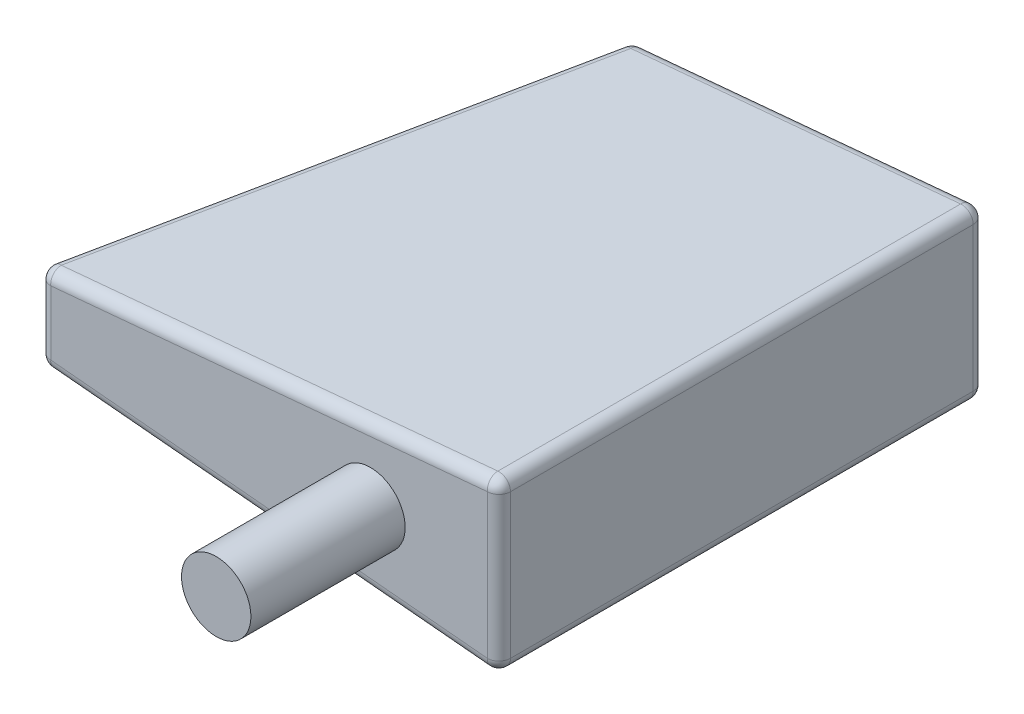
ISO-10303-21;
HEADER;
FILE_DESCRIPTION(('STEP AP214'),'2;1');
FILE_NAME('part.step','',(''),(''),'','','');
FILE_SCHEMA(('AUTOMOTIVE_DESIGN { 1 0 10303 214 1 1 1 1 }'));
ENDSEC;
DATA;
#1=APPLICATION_CONTEXT('core data for automotive mechanical design processes');
#2=APPLICATION_PROTOCOL_DEFINITION('international standard','automotive_design',2000,#1);
#3=PRODUCT_CONTEXT('',#1,'mechanical');
#4=PRODUCT('Part','Part','',(#3));
#5=PRODUCT_RELATED_PRODUCT_CATEGORY('part','',(#4));
#6=PRODUCT_DEFINITION_FORMATION('','',#4);
#7=PRODUCT_DEFINITION_CONTEXT('part definition',#1,'design');
#8=PRODUCT_DEFINITION('design','',#6,#7);
#9=PRODUCT_DEFINITION_SHAPE('','',#8);
#10=(LENGTH_UNIT() NAMED_UNIT(*) SI_UNIT(.MILLI.,.METRE.));
#11=(NAMED_UNIT(*) PLANE_ANGLE_UNIT() SI_UNIT($,.RADIAN.));
#12=(NAMED_UNIT(*) SI_UNIT($,.STERADIAN.) SOLID_ANGLE_UNIT());
#13=UNCERTAINTY_MEASURE_WITH_UNIT(LENGTH_MEASURE(1.E-05),#10,'distance_accuracy_value','');
#14=(GEOMETRIC_REPRESENTATION_CONTEXT(3) GLOBAL_UNCERTAINTY_ASSIGNED_CONTEXT((#13)) GLOBAL_UNIT_ASSIGNED_CONTEXT((#10,
#11,#12)) REPRESENTATION_CONTEXT('',''));
#15=CARTESIAN_POINT('',(0.,0.,0.));
#16=DIRECTION('',(0.,0.,1.));
#17=DIRECTION('',(1.,0.,0.));
#18=AXIS2_PLACEMENT_3D('',#15,#16,#17);
#19=CARTESIAN_POINT('',(-130.198606722362,2.75,167.44232142799));
#20=DIRECTION('',(-0.0912839495849539,0.995824904563132,0.));
#21=DIRECTION('',(-0.995824904563132,-0.0912839495849539,0.));
#22=AXIS2_PLACEMENT_3D('',#19,#20,#21);
#23=PLANE('',#22);
#24=DIRECTION('',(0.,0.,1.));
#25=VECTOR('',#24,1.);
#26=CARTESIAN_POINT('',(-101.017069684551,5.42497422846603,167.44232142799));
#27=LINE('',#26,#25);
#28=CARTESIAN_POINT('',(-101.017069684551,5.42497422846603,205.692321429153));
#29=VERTEX_POINT('',#28);
#30=CARTESIAN_POINT('',(-101.017069684551,5.42497422846603,175.69232142799));
#31=VERTEX_POINT('',#30);
#32=EDGE_CURVE('E198',#29,#31,#27,.F.);
#33=ORIENTED_EDGE('',*,*,#32,.T.);
#34=DIRECTION('',(0.995824904563132,0.0912839495849539,0.));
#35=VECTOR('',#34,1.);
#36=CARTESIAN_POINT('',(-122.224993582982,3.4809145377765,175.69232142799));
#37=LINE('',#36,#35);
#38=CARTESIAN_POINT('',(-122.398144726326,3.46504234963662,175.69232142799));
#39=VERTEX_POINT('',#38);
#40=EDGE_CURVE('E242',#31,#39,#37,.F.);
#41=ORIENTED_EDGE('',*,*,#40,.T.);
#42=DIRECTION('',(-0.224903244369558,-0.0206161307338762,0.974162977034957));
#43=VECTOR('',#42,1.);
#44=CARTESIAN_POINT('',(-120.988506529526,3.59425918434334,169.586507587079));
#45=LINE('',#44,#43);
#46=CARTESIAN_POINT('',(-129.324190460362,2.83015482401671,205.692321429153));
#47=VERTEX_POINT('',#46);
#48=EDGE_CURVE('E193',#39,#47,#45,.T.);
#49=ORIENTED_EDGE('',*,*,#48,.T.);
#50=DIRECTION('',(-0.995824904563132,-0.0912839495849539,0.));
#51=VECTOR('',#50,1.);
#52=CARTESIAN_POINT('',(-130.198606722362,2.75,205.692321429153));
#53=LINE('',#52,#51);
#54=EDGE_CURVE('E195',#47,#29,#53,.F.);
#55=ORIENTED_EDGE('',*,*,#54,.T.);
#56=EDGE_LOOP('',(#33,#41,#49,#55));
#57=FACE_BOUND('',#56,.T.);
#58=ADVANCED_FACE('F48',(#57),#23,.T.);
#59=CARTESIAN_POINT('',(-100.198606722362,-5.5,167.44232142799));
#60=DIRECTION('',(-0.0912839495849537,-0.995824904563132,0.));
#61=DIRECTION('',(0.995824904563132,-0.0912839495849537,0.));
#62=AXIS2_PLACEMENT_3D('',#59,#60,#61);
#63=PLANE('',#62);
#64=DIRECTION('',(0.224903244369558,-0.0206161307338762,-0.974162977034957));
#65=VECTOR('',#64,1.);
#66=CARTESIAN_POINT('',(-119.458311704294,-3.73452704332291,162.958505618634));
#67=LINE('',#66,#65);
#68=CARTESIAN_POINT('',(-129.324190460362,-2.83015482401672,205.692321429153));
#69=VERTEX_POINT('',#68);
#70=CARTESIAN_POINT('',(-122.398144726326,-3.46504234963662,175.69232142799));
#71=VERTEX_POINT('',#70);
#72=EDGE_CURVE('E201',#69,#71,#67,.T.);
#73=ORIENTED_EDGE('',*,*,#72,.T.);
#74=DIRECTION('',(-0.995824904563132,0.0912839495849537,0.));
#75=VECTOR('',#74,1.);
#76=CARTESIAN_POINT('',(-101.017069684551,-5.42497422846604,175.69232142799));
#77=LINE('',#76,#75);
#78=CARTESIAN_POINT('',(-101.017069684551,-5.42497422846604,175.69232142799));
#79=VERTEX_POINT('',#78);
#80=EDGE_CURVE('E72',#71,#79,#77,.F.);
#81=ORIENTED_EDGE('',*,*,#80,.T.);
#82=DIRECTION('',(0.,0.,1.));
#83=VECTOR('',#82,1.);
#84=CARTESIAN_POINT('',(-101.017069684551,-5.42497422846604,167.44232142799));
#85=LINE('',#84,#83);
#86=CARTESIAN_POINT('',(-101.017069684551,-5.42497422846604,205.692321429153));
#87=VERTEX_POINT('',#86);
#88=EDGE_CURVE('E206',#79,#87,#85,.T.);
#89=ORIENTED_EDGE('',*,*,#88,.T.);
#90=DIRECTION('',(0.995824904563132,-0.0912839495849537,0.));
#91=VECTOR('',#90,1.);
#92=CARTESIAN_POINT('',(-100.198606722362,-5.5,205.692321429153));
#93=LINE('',#92,#91);
#94=EDGE_CURVE('E203',#87,#69,#93,.F.);
#95=ORIENTED_EDGE('',*,*,#94,.T.);
#96=EDGE_LOOP('',(#73,#81,#89,#95));
#97=FACE_BOUND('',#96,.T.);
#98=ADVANCED_FACE('F284',(#97),#63,.T.);
#99=CARTESIAN_POINT('',(-100.198606721144,-4.4532716159149E-05,206.442321429153));
#100=DIRECTION('',(0.,0.,1.));
#101=DIRECTION('',(1.,0.,0.));
#102=AXIS2_PLACEMENT_3D('',#99,#100,#101);
#103=PLANE('',#102);
#104=DIRECTION('',(0.,1.,0.));
#105=VECTOR('',#104,1.);
#106=CARTESIAN_POINT('',(-100.948606722362,-4.4532716159149E-05,206.442321429153));
#107=LINE('',#106,#105);
#108=CARTESIAN_POINT('',(-100.948606722362,-4.67810555004369,206.442321429153));
#109=VERTEX_POINT('',#108);
#110=CARTESIAN_POINT('',(-100.948606722362,4.67810555004369,206.442321429153));
#111=VERTEX_POINT('',#110);
#112=EDGE_CURVE('E168',#109,#111,#107,.T.);
#113=ORIENTED_EDGE('',*,*,#112,.T.);
#114=DIRECTION('',(-0.995824904563132,-0.0912839495849539,0.));
#115=VECTOR('',#114,1.);
#116=CARTESIAN_POINT('',(-100.630113374225,4.70730077362293,206.442321429153));
#117=LINE('',#116,#115);
#118=CARTESIAN_POINT('',(-129.255727498173,2.08328614559436,206.442321429153));
#119=VERTEX_POINT('',#118);
#120=EDGE_CURVE('E174',#111,#119,#117,.T.);
#121=ORIENTED_EDGE('',*,*,#120,.T.);
#122=DIRECTION('',(0.,-1.,0.));
#123=VECTOR('',#122,1.);
#124=CARTESIAN_POINT('',(-129.255727498173,-4.4532716159149E-05,206.442321429153));
#125=LINE('',#124,#123);
#126=CARTESIAN_POINT('',(-129.255727498173,-2.08328614559437,206.442321429153));
#127=VERTEX_POINT('',#126);
#128=EDGE_CURVE('E144',#119,#127,#125,.T.);
#129=ORIENTED_EDGE('',*,*,#128,.T.);
#130=DIRECTION('',(0.995824904563132,-0.0912839495849537,0.));
#131=VECTOR('',#130,1.);
#132=CARTESIAN_POINT('',(-100.630105277925,-4.70730151578375,206.442321429153));
#133=LINE('',#132,#131);
#134=EDGE_CURVE('E162',#127,#109,#133,.T.);
#135=ORIENTED_EDGE('',*,*,#134,.T.);
#136=EDGE_LOOP('',(#113,#121,#129,#135));
#137=FACE_BOUND('',#136,.T.);
#138=CARTESIAN_POINT('',(-108.529819655251,0.,206.442321429153));
#139=DIRECTION('',(0.,0.,1.));
#140=DIRECTION('',(1.,0.,0.));
#141=AXIS2_PLACEMENT_3D('',#138,#139,#140);
#142=CIRCLE('',#141,2.25);
#143=CARTESIAN_POINT('',(-106.279819655251,0.,206.442321429153));
#144=VERTEX_POINT('',#143);
#145=EDGE_CURVE('E230',#144,#144,#142,.T.);
#146=ORIENTED_EDGE('',*,*,#145,.F.);
#147=EDGE_LOOP('',(#146));
#148=FACE_BOUND('',#147,.T.);
#149=ADVANCED_FACE('F171',(#137,#148),#103,.T.);
#150=CARTESIAN_POINT('',(-108.529819655251,0.,216.442321429153));
#151=DIRECTION('',(0.,0.,-1.));
#152=DIRECTION('',(-1.,0.,0.));
#153=AXIS2_PLACEMENT_3D('',#150,#151,#152);
#154=CYLINDRICAL_SURFACE('',#153,2.25);
#155=CARTESIAN_POINT('',(-108.529819655251,0.,216.442321429153));
#156=DIRECTION('',(0.,0.,1.));
#157=DIRECTION('',(1.,0.,0.));
#158=AXIS2_PLACEMENT_3D('',#155,#156,#157);
#159=CIRCLE('',#158,2.25);
#160=CARTESIAN_POINT('',(-106.279819655251,0.,216.442321429153));
#161=VERTEX_POINT('',#160);
#162=EDGE_CURVE('E169',#161,#161,#159,.T.);
#163=ORIENTED_EDGE('',*,*,#162,.F.);
#164=EDGE_LOOP('',(#163));
#165=FACE_BOUND('',#164,.T.);
#166=ORIENTED_EDGE('',*,*,#145,.T.);
#167=EDGE_LOOP('',(#166));
#168=FACE_BOUND('',#167,.T.);
#169=ADVANCED_FACE('F339',(#165,#168),#154,.T.);
#170=CARTESIAN_POINT('',(-108.529819655251,0.,216.442321429153));
#171=DIRECTION('',(0.,0.,1.));
#172=DIRECTION('',(1.,0.,0.));
#173=AXIS2_PLACEMENT_3D('',#170,#171,#172);
#174=PLANE('',#173);
#175=ORIENTED_EDGE('',*,*,#162,.T.);
#176=EDGE_LOOP('',(#175));
#177=FACE_BOUND('',#176,.T.);
#178=ADVANCED_FACE('F324',(#177),#174,.T.);
#179=CARTESIAN_POINT('',(-100.198606722362,5.5,167.44232142799));
#180=DIRECTION('',(1.,0.,0.));
#181=DIRECTION('',(0.,0.,-1.));
#182=AXIS2_PLACEMENT_3D('',#179,#180,#181);
#183=PLANE('',#182);
#184=DIRECTION('',(0.,0.,1.));
#185=VECTOR('',#184,1.);
#186=CARTESIAN_POINT('',(-100.198606722362,-4.67810555004369,167.44232142799));
#187=LINE('',#186,#185);
#188=CARTESIAN_POINT('',(-100.198606722362,-4.67810555004369,205.692321429153));
#189=VERTEX_POINT('',#188);
#190=CARTESIAN_POINT('',(-100.198606722362,-4.67810555004369,175.69232142799));
#191=VERTEX_POINT('',#190);
#192=EDGE_CURVE('E186',#189,#191,#187,.F.);
#193=ORIENTED_EDGE('',*,*,#192,.T.);
#194=DIRECTION('',(0.,-1.,0.));
#195=VECTOR('',#194,1.);
#196=CARTESIAN_POINT('',(-100.198606722362,4.67810555004368,175.69232142799));
#197=LINE('',#196,#195);
#198=CARTESIAN_POINT('',(-100.198606722362,4.67810555004368,175.69232142799));
#199=VERTEX_POINT('',#198);
#200=EDGE_CURVE('E12',#191,#199,#197,.F.);
#201=ORIENTED_EDGE('',*,*,#200,.T.);
#202=DIRECTION('',(0.,0.,1.));
#203=VECTOR('',#202,1.);
#204=CARTESIAN_POINT('',(-100.198606722362,4.67810555004368,167.44232142799));
#205=LINE('',#204,#203);
#206=CARTESIAN_POINT('',(-100.198606722362,4.67810555004368,205.692321429153));
#207=VERTEX_POINT('',#206);
#208=EDGE_CURVE('E191',#199,#207,#205,.T.);
#209=ORIENTED_EDGE('',*,*,#208,.T.);
#210=DIRECTION('',(0.,1.,0.));
#211=VECTOR('',#210,1.);
#212=CARTESIAN_POINT('',(-100.198606722362,5.5,205.692321429153));
#213=LINE('',#212,#211);
#214=EDGE_CURVE('E188',#207,#189,#213,.F.);
#215=ORIENTED_EDGE('',*,*,#214,.T.);
#216=EDGE_LOOP('',(#193,#201,#209,#215));
#217=FACE_BOUND('',#216,.T.);
#218=ADVANCED_FACE('F316',(#217),#183,.T.);
#219=CARTESIAN_POINT('',(-130.198606722362,10.,206.442321429153));
#220=DIRECTION('',(-0.974370064785234,0.,-0.224951054343869));
#221=DIRECTION('',(-0.224951054343869,0.,0.974370064785234));
#222=AXIS2_PLACEMENT_3D('',#219,#220,#221);
#223=PLANE('',#222);
#224=DIRECTION('',(-0.224903244369558,-0.0206161307338762,0.974162977034957));
#225=VECTOR('',#224,1.);
#226=CARTESIAN_POINT('',(-130.161809663805,2.06721655569877,206.282935857766));
#227=LINE('',#226,#225);
#228=CARTESIAN_POINT('',(-129.986505046762,2.08328614559436,205.523608138395));
#229=VERTEX_POINT('',#228);
#230=CARTESIAN_POINT('',(-123.060459312727,2.71817367121427,175.523608137232));
#231=VERTEX_POINT('',#230);
#232=EDGE_CURVE('E183',#229,#231,#227,.F.);
#233=ORIENTED_EDGE('',*,*,#232,.T.);
#234=DIRECTION('',(0.,1.,0.));
#235=VECTOR('',#234,1.);
#236=CARTESIAN_POINT('',(-123.060459312727,-2.73047539389735,175.523608137232));
#237=LINE('',#236,#235);
#238=CARTESIAN_POINT('',(-123.060459312727,-2.71817367121427,175.523608137232));
#239=VERTEX_POINT('',#238);
#240=EDGE_CURVE('E246',#231,#239,#237,.F.);
#241=ORIENTED_EDGE('',*,*,#240,.T.);
#242=DIRECTION('',(0.224903244369558,-0.0206161307338762,-0.974162977034957));
#243=VECTOR('',#242,1.);
#244=CARTESIAN_POINT('',(-130.254542357573,-2.05871605877006,206.684605283579));
#245=LINE('',#244,#243);
#246=CARTESIAN_POINT('',(-129.986505046762,-2.08328614559437,205.523608138395));
#247=VERTEX_POINT('',#246);
#248=EDGE_CURVE('E177',#239,#247,#245,.F.);
#249=ORIENTED_EDGE('',*,*,#248,.T.);
#250=DIRECTION('',(0.,-1.,0.));
#251=VECTOR('',#250,1.);
#252=CARTESIAN_POINT('',(-129.986505046762,10.,205.523608138395));
#253=LINE('',#252,#251);
#254=EDGE_CURVE('E146',#247,#229,#253,.F.);
#255=ORIENTED_EDGE('',*,*,#254,.T.);
#256=EDGE_LOOP('',(#233,#241,#249,#255));
#257=FACE_BOUND('',#256,.T.);
#258=ADVANCED_FACE('F313',(#257),#223,.T.);
#259=CARTESIAN_POINT('',(-100.948606722362,4.67810555004368,167.44232142799));
#260=DIRECTION('',(0.,0.,1.));
#261=DIRECTION('',(1.,0.,0.));
#262=AXIS2_PLACEMENT_3D('',#259,#260,#261);
#263=CYLINDRICAL_SURFACE('',#262,0.75);
#264=ORIENTED_EDGE('',*,*,#208,.F.);
#265=CARTESIAN_POINT('',(-100.948606722362,4.67810555004368,175.69232142799));
#266=DIRECTION('',(0.,0.,1.));
#267=DIRECTION('',(1.,0.,0.));
#268=AXIS2_PLACEMENT_3D('',#265,#266,#267);
#269=CIRCLE('',#268,0.75);
#270=EDGE_CURVE('E207',#199,#31,#269,.T.);
#271=ORIENTED_EDGE('',*,*,#270,.T.);
#272=ORIENTED_EDGE('',*,*,#32,.F.);
#273=CARTESIAN_POINT('',(-100.948606722362,4.67810555004368,205.692321429153));
#274=DIRECTION('',(0.,0.,1.));
#275=DIRECTION('',(1.,0.,0.));
#276=AXIS2_PLACEMENT_3D('',#273,#274,#275);
#277=CIRCLE('',#276,0.75);
#278=EDGE_CURVE('E227',#207,#29,#277,.T.);
#279=ORIENTED_EDGE('',*,*,#278,.F.);
#280=EDGE_LOOP('',(#264,#271,#272,#279));
#281=FACE_BOUND('',#280,.T.);
#282=ADVANCED_FACE('F315',(#281),#263,.T.);
#283=CARTESIAN_POINT('',(-100.948606722362,-4.4532716159149E-05,205.692321429153));
#284=DIRECTION('',(0.,1.,0.));
#285=DIRECTION('',(0.,0.,1.));
#286=AXIS2_PLACEMENT_3D('',#283,#284,#285);
#287=CYLINDRICAL_SURFACE('',#286,0.75);
#288=CARTESIAN_POINT('',(-100.948606722362,-4.67810555004369,205.692321429153));
#289=DIRECTION('',(0.,-1.,0.));
#290=DIRECTION('',(0.,0.,-1.));
#291=AXIS2_PLACEMENT_3D('',#288,#289,#290);
#292=CIRCLE('',#291,0.75);
#293=EDGE_CURVE('E221',#189,#109,#292,.T.);
#294=ORIENTED_EDGE('',*,*,#293,.F.);
#295=ORIENTED_EDGE('',*,*,#214,.F.);
#296=CARTESIAN_POINT('',(-100.948606722362,4.67810555004369,205.692321429153));
#297=DIRECTION('',(0.,1.,0.));
#298=DIRECTION('',(-1.,0.,0.));
#299=AXIS2_PLACEMENT_3D('',#296,#297,#298);
#300=CIRCLE('',#299,0.75);
#301=EDGE_CURVE('E224',#111,#207,#300,.T.);
#302=ORIENTED_EDGE('',*,*,#301,.F.);
#303=ORIENTED_EDGE('',*,*,#112,.F.);
#304=EDGE_LOOP('',(#294,#295,#302,#303));
#305=FACE_BOUND('',#304,.T.);
#306=ADVANCED_FACE('F293',(#305),#287,.T.);
#307=CARTESIAN_POINT('',(-100.948606722362,-4.67810555004369,167.44232142799));
#308=DIRECTION('',(0.,0.,1.));
#309=DIRECTION('',(1.,0.,0.));
#310=AXIS2_PLACEMENT_3D('',#307,#308,#309);
#311=CYLINDRICAL_SURFACE('',#310,0.75);
#312=ORIENTED_EDGE('',*,*,#88,.F.);
#313=CARTESIAN_POINT('',(-100.948606722362,-4.67810555004369,175.69232142799));
#314=DIRECTION('',(0.,0.,1.));
#315=DIRECTION('',(1.,0.,0.));
#316=AXIS2_PLACEMENT_3D('',#313,#314,#315);
#317=CIRCLE('',#316,0.75);
#318=EDGE_CURVE('E57',#79,#191,#317,.T.);
#319=ORIENTED_EDGE('',*,*,#318,.T.);
#320=ORIENTED_EDGE('',*,*,#192,.F.);
#321=CARTESIAN_POINT('',(-100.948606722362,-4.67810555004369,205.692321429153));
#322=DIRECTION('',(0.,0.,1.));
#323=DIRECTION('',(1.,0.,0.));
#324=AXIS2_PLACEMENT_3D('',#321,#322,#323);
#325=CIRCLE('',#324,0.75);
#326=EDGE_CURVE('E219',#87,#189,#325,.T.);
#327=ORIENTED_EDGE('',*,*,#326,.F.);
#328=EDGE_LOOP('',(#312,#319,#320,#327));
#329=FACE_BOUND('',#328,.T.);
#330=ADVANCED_FACE('F287',(#329),#311,.T.);
#331=CARTESIAN_POINT('',(-100.948606722362,4.67810555004368,205.692321429153));
#332=DIRECTION('',(0.,0.,1.));
#333=DIRECTION('',(0.,-1.,0.));
#334=AXIS2_PLACEMENT_3D('',#331,#332,#333);
#335=SPHERICAL_SURFACE('',#334,0.75);
#336=ORIENTED_EDGE('',*,*,#301,.T.);
#337=ORIENTED_EDGE('',*,*,#278,.T.);
#338=CARTESIAN_POINT('',(-100.948606722362,4.67810555004368,205.692321429153));
#339=DIRECTION('',(0.995824904563133,0.0912839495849454,0.));
#340=DIRECTION('',(-0.0912839495849454,0.995824904563133,0.));
#341=AXIS2_PLACEMENT_3D('',#338,#339,#340);
#342=CIRCLE('',#341,0.75);
#343=EDGE_CURVE('E217',#111,#29,#342,.F.);
#344=ORIENTED_EDGE('',*,*,#343,.F.);
#345=EDGE_LOOP('',(#336,#337,#344));
#346=FACE_BOUND('',#345,.T.);
#347=ADVANCED_FACE('F298',(#346),#335,.T.);
#348=CARTESIAN_POINT('',(-100.948606722362,-4.67810555004369,205.692321429153));
#349=DIRECTION('',(0.,0.,1.));
#350=DIRECTION('',(0.,-1.,0.));
#351=AXIS2_PLACEMENT_3D('',#348,#349,#350);
#352=SPHERICAL_SURFACE('',#351,0.75);
#353=ORIENTED_EDGE('',*,*,#326,.T.);
#354=ORIENTED_EDGE('',*,*,#293,.T.);
#355=CARTESIAN_POINT('',(-100.948606722362,-4.67810555004369,205.692321429153));
#356=DIRECTION('',(0.995824904563133,-0.0912839495849456,0.));
#357=DIRECTION('',(0.0912839495849456,0.995824904563133,0.));
#358=AXIS2_PLACEMENT_3D('',#355,#356,#357);
#359=CIRCLE('',#358,0.75);
#360=EDGE_CURVE('E165',#87,#109,#359,.F.);
#361=ORIENTED_EDGE('',*,*,#360,.F.);
#362=EDGE_LOOP('',(#353,#354,#361));
#363=FACE_BOUND('',#362,.T.);
#364=ADVANCED_FACE('F290',(#363),#352,.T.);
#365=CARTESIAN_POINT('',(-120.920043567337,2.84739050592099,169.586507587079));
#366=DIRECTION('',(-0.224903244369558,-0.0206161307338762,0.974162977034957));
#367=DIRECTION('',(0.974370064785234,0.,0.224951054343869));
#368=AXIS2_PLACEMENT_3D('',#365,#366,#367);
#369=CYLINDRICAL_SURFACE('',#368,0.75);
#370=ORIENTED_EDGE('',*,*,#48,.F.);
#371=CARTESIAN_POINT('',(-122.329681764138,2.71817367121427,175.69232142799));
#372=DIRECTION('',(-0.224903244369558,-0.0206161307338762,0.974162977034957));
#373=DIRECTION('',(0.974370064785234,0.,0.224951054343869));
#374=AXIS2_PLACEMENT_3D('',#371,#372,#373);
#375=CIRCLE('',#374,0.75);
#376=EDGE_CURVE('E244',#39,#231,#375,.T.);
#377=ORIENTED_EDGE('',*,*,#376,.T.);
#378=ORIENTED_EDGE('',*,*,#232,.F.);
#379=CARTESIAN_POINT('',(-129.255727498173,2.08328614559436,205.692321429153));
#380=DIRECTION('',(-0.224903244369566,-0.0206161307338749,0.974162977034955));
#381=DIRECTION('',(0.974370064785233,0.,0.224951054343877));
#382=AXIS2_PLACEMENT_3D('',#379,#380,#381);
#383=CIRCLE('',#382,0.75);
#384=EDGE_CURVE('E213',#47,#229,#383,.T.);
#385=ORIENTED_EDGE('',*,*,#384,.F.);
#386=EDGE_LOOP('',(#370,#377,#378,#385));
#387=FACE_BOUND('',#386,.T.);
#388=ADVANCED_FACE('F310',(#387),#369,.T.);
#389=CARTESIAN_POINT('',(-100.630113374225,4.70730077362292,205.692321429153));
#390=DIRECTION('',(-0.995824904563132,-0.0912839495849539,0.));
#391=DIRECTION('',(0.0912839495849539,-0.995824904563132,0.));
#392=AXIS2_PLACEMENT_3D('',#389,#390,#391);
#393=CYLINDRICAL_SURFACE('',#392,0.75);
#394=ORIENTED_EDGE('',*,*,#343,.T.);
#395=ORIENTED_EDGE('',*,*,#54,.F.);
#396=CARTESIAN_POINT('',(-129.255727498173,2.08328614559436,205.692321429153));
#397=DIRECTION('',(-0.995824904563133,-0.0912839495849455,0.));
#398=DIRECTION('',(0.0912839495849455,-0.995824904563133,0.));
#399=AXIS2_PLACEMENT_3D('',#396,#397,#398);
#400=CIRCLE('',#399,0.75);
#401=EDGE_CURVE('E159',#119,#47,#400,.T.);
#402=ORIENTED_EDGE('',*,*,#401,.F.);
#403=ORIENTED_EDGE('',*,*,#120,.F.);
#404=EDGE_LOOP('',(#394,#395,#402,#403));
#405=FACE_BOUND('',#404,.T.);
#406=ADVANCED_FACE('F302',(#405),#393,.T.);
#407=CARTESIAN_POINT('',(-100.630105277925,-4.70730151578375,205.692321429153));
#408=DIRECTION('',(0.995824904563132,-0.0912839495849537,0.));
#409=DIRECTION('',(0.0912839495849537,0.995824904563132,0.));
#410=AXIS2_PLACEMENT_3D('',#407,#408,#409);
#411=CYLINDRICAL_SURFACE('',#410,0.75);
#412=ORIENTED_EDGE('',*,*,#360,.T.);
#413=ORIENTED_EDGE('',*,*,#134,.F.);
#414=CARTESIAN_POINT('',(-129.255727498173,-2.08328614559437,205.692321429153));
#415=DIRECTION('',(-0.995824904563133,0.0912839495849453,0.));
#416=DIRECTION('',(-0.0912839495849453,-0.995824904563133,0.));
#417=AXIS2_PLACEMENT_3D('',#414,#415,#416);
#418=CIRCLE('',#417,0.75);
#419=EDGE_CURVE('E151',#69,#127,#418,.T.);
#420=ORIENTED_EDGE('',*,*,#419,.F.);
#421=ORIENTED_EDGE('',*,*,#94,.F.);
#422=EDGE_LOOP('',(#412,#413,#420,#421));
#423=FACE_BOUND('',#422,.T.);
#424=ADVANCED_FACE('F163',(#423),#411,.T.);
#425=CARTESIAN_POINT('',(-119.389848742105,-2.98765836490056,162.958505618634));
#426=DIRECTION('',(0.224903244369558,-0.0206161307338762,-0.974162977034957));
#427=DIRECTION('',(-0.974370064785234,0.,-0.224951054343869));
#428=AXIS2_PLACEMENT_3D('',#425,#426,#427);
#429=CYLINDRICAL_SURFACE('',#428,0.75);
#430=ORIENTED_EDGE('',*,*,#248,.F.);
#431=CARTESIAN_POINT('',(-122.329681764138,-2.71817367121427,175.69232142799));
#432=DIRECTION('',(0.224903244369558,-0.0206161307338762,-0.974162977034957));
#433=DIRECTION('',(-0.974370064785234,0.,-0.224951054343869));
#434=AXIS2_PLACEMENT_3D('',#431,#432,#433);
#435=CIRCLE('',#434,0.75);
#436=EDGE_CURVE('E248',#239,#71,#435,.F.);
#437=ORIENTED_EDGE('',*,*,#436,.T.);
#438=ORIENTED_EDGE('',*,*,#72,.F.);
#439=CARTESIAN_POINT('',(-129.255727498173,-2.08328614559437,205.692321429153));
#440=DIRECTION('',(-0.224903244369566,0.020616130733875,0.974162977034955));
#441=DIRECTION('',(0.974370064785233,0.,0.224951054343877));
#442=AXIS2_PLACEMENT_3D('',#439,#440,#441);
#443=CIRCLE('',#442,0.75);
#444=EDGE_CURVE('E155',#247,#69,#443,.T.);
#445=ORIENTED_EDGE('',*,*,#444,.F.);
#446=EDGE_LOOP('',(#430,#437,#438,#445));
#447=FACE_BOUND('',#446,.T.);
#448=ADVANCED_FACE('F283',(#447),#429,.T.);
#449=CARTESIAN_POINT('',(-129.255727498173,2.08328614559436,205.692321429153));
#450=DIRECTION('',(-0.0912839495849454,0.995824904563133,0.));
#451=DIRECTION('',(-0.995824904563133,-0.0912839495849454,0.));
#452=AXIS2_PLACEMENT_3D('',#449,#450,#451);
#453=SPHERICAL_SURFACE('',#452,0.75);
#454=ORIENTED_EDGE('',*,*,#401,.T.);
#455=ORIENTED_EDGE('',*,*,#384,.T.);
#456=CARTESIAN_POINT('',(-129.255727498173,2.08328614559436,205.692321429153));
#457=DIRECTION('',(0.,1.,0.));
#458=DIRECTION('',(0.,0.,1.));
#459=AXIS2_PLACEMENT_3D('',#456,#457,#458);
#460=CIRCLE('',#459,0.75);
#461=EDGE_CURVE('E148',#119,#229,#460,.F.);
#462=ORIENTED_EDGE('',*,*,#461,.F.);
#463=EDGE_LOOP('',(#454,#455,#462));
#464=FACE_BOUND('',#463,.T.);
#465=ADVANCED_FACE('F306',(#464),#453,.T.);
#466=CARTESIAN_POINT('',(-129.255727498173,-2.08328614559437,205.692321429153));
#467=DIRECTION('',(-0.0912839495849454,-0.995824904563133,0.));
#468=DIRECTION('',(0.995824904563133,-0.0912839495849454,0.));
#469=AXIS2_PLACEMENT_3D('',#466,#467,#468);
#470=SPHERICAL_SURFACE('',#469,0.75);
#471=ORIENTED_EDGE('',*,*,#444,.T.);
#472=ORIENTED_EDGE('',*,*,#419,.T.);
#473=CARTESIAN_POINT('',(-129.255727498173,-2.08328614559437,205.692321429153));
#474=DIRECTION('',(0.,-1.,0.));
#475=DIRECTION('',(1.,0.,0.));
#476=AXIS2_PLACEMENT_3D('',#473,#474,#475);
#477=CIRCLE('',#476,0.75);
#478=EDGE_CURVE('E140',#247,#127,#477,.F.);
#479=ORIENTED_EDGE('',*,*,#478,.F.);
#480=EDGE_LOOP('',(#471,#472,#479));
#481=FACE_BOUND('',#480,.T.);
#482=ADVANCED_FACE('F153',(#481),#470,.T.);
#483=CARTESIAN_POINT('',(-129.255727498173,-4.4532716159149E-05,205.692321429153));
#484=DIRECTION('',(0.,-1.,0.));
#485=DIRECTION('',(0.,0.,-1.));
#486=AXIS2_PLACEMENT_3D('',#483,#484,#485);
#487=CYLINDRICAL_SURFACE('',#486,0.75);
#488=ORIENTED_EDGE('',*,*,#461,.T.);
#489=ORIENTED_EDGE('',*,*,#254,.F.);
#490=ORIENTED_EDGE('',*,*,#478,.T.);
#491=ORIENTED_EDGE('',*,*,#128,.F.);
#492=EDGE_LOOP('',(#488,#489,#490,#491));
#493=FACE_BOUND('',#492,.T.);
#494=ADVANCED_FACE('F142',(#493),#487,.T.);
#495=CARTESIAN_POINT('',(-125.773388526529,-5.42810555004369,174.94232142799));
#496=DIRECTION('',(0.,0.,1.));
#497=DIRECTION('',(1.,0.,0.));
#498=AXIS2_PLACEMENT_3D('',#495,#496,#497);
#499=PLANE('',#498);
#500=DIRECTION('',(0.,1.,0.));
#501=VECTOR('',#500,1.);
#502=CARTESIAN_POINT('',(-122.329681764138,2.73047539389734,174.94232142799));
#503=LINE('',#502,#501);
#504=CARTESIAN_POINT('',(-122.329681764138,-2.71817367121428,174.94232142799));
#505=VERTEX_POINT('',#504);
#506=CARTESIAN_POINT('',(-122.329681764138,2.71817367121427,174.94232142799));
#507=VERTEX_POINT('',#506);
#508=EDGE_CURVE('E237',#505,#507,#503,.T.);
#509=ORIENTED_EDGE('',*,*,#508,.T.);
#510=DIRECTION('',(0.995824904563132,0.0912839495849539,0.));
#511=VECTOR('',#510,1.);
#512=CARTESIAN_POINT('',(-100.948606722362,4.67810555004369,174.94232142799));
#513=LINE('',#512,#511);
#514=CARTESIAN_POINT('',(-100.948606722362,4.67810555004368,174.94232142799));
#515=VERTEX_POINT('',#514);
#516=EDGE_CURVE('E239',#507,#515,#513,.T.);
#517=ORIENTED_EDGE('',*,*,#516,.T.);
#518=DIRECTION('',(0.,-1.,0.));
#519=VECTOR('',#518,1.);
#520=CARTESIAN_POINT('',(-100.948606722362,-4.67810555004369,174.94232142799));
#521=LINE('',#520,#519);
#522=CARTESIAN_POINT('',(-100.948606722362,-4.67810555004369,174.94232142799));
#523=VERTEX_POINT('',#522);
#524=EDGE_CURVE('E233',#515,#523,#521,.T.);
#525=ORIENTED_EDGE('',*,*,#524,.T.);
#526=DIRECTION('',(-0.995824904563132,0.0912839495849537,0.));
#527=VECTOR('',#526,1.);
#528=CARTESIAN_POINT('',(-122.156530620794,-2.73404585935416,174.94232142799));
#529=LINE('',#528,#527);
#530=EDGE_CURVE('E235',#523,#505,#529,.T.);
#531=ORIENTED_EDGE('',*,*,#530,.T.);
#532=EDGE_LOOP('',(#509,#517,#525,#531));
#533=FACE_BOUND('',#532,.T.);
#534=ADVANCED_FACE('F347',(#533),#499,.F.);
#535=CARTESIAN_POINT('',(-122.329681764138,-2.71817367121427,175.69232142799));
#536=DIRECTION('',(0.,0.,1.));
#537=DIRECTION('',(1.,0.,0.));
#538=AXIS2_PLACEMENT_3D('',#535,#536,#537);
#539=SPHERICAL_SURFACE('',#538,0.75);
#540=CARTESIAN_POINT('',(-122.329681764138,-2.71817367121427,175.69232142799));
#541=DIRECTION('',(0.995824904563133,-0.0912839495849452,0.));
#542=DIRECTION('',(0.0912839495849452,0.995824904563133,0.));
#543=AXIS2_PLACEMENT_3D('',#540,#541,#542);
#544=CIRCLE('',#543,0.75);
#545=EDGE_CURVE('E267',#71,#505,#544,.T.);
#546=ORIENTED_EDGE('',*,*,#545,.F.);
#547=ORIENTED_EDGE('',*,*,#436,.F.);
#548=CARTESIAN_POINT('',(-122.329681764138,-2.71817367121427,175.69232142799));
#549=DIRECTION('',(0.,1.,0.));
#550=DIRECTION('',(0.,0.,1.));
#551=AXIS2_PLACEMENT_3D('',#548,#549,#550);
#552=CIRCLE('',#551,0.75);
#553=EDGE_CURVE('E52',#505,#239,#552,.T.);
#554=ORIENTED_EDGE('',*,*,#553,.F.);
#555=EDGE_LOOP('',(#546,#547,#554));
#556=FACE_BOUND('',#555,.T.);
#557=ADVANCED_FACE('F50',(#556),#539,.T.);
#558=CARTESIAN_POINT('',(-122.329681764138,-5.42810555004369,175.69232142799));
#559=DIRECTION('',(0.,-1.,0.));
#560=DIRECTION('',(0.,0.,-1.));
#561=AXIS2_PLACEMENT_3D('',#558,#559,#560);
#562=CYLINDRICAL_SURFACE('',#561,0.75);
#563=ORIENTED_EDGE('',*,*,#553,.T.);
#564=ORIENTED_EDGE('',*,*,#240,.F.);
#565=CARTESIAN_POINT('',(-122.329681764138,2.71817367121427,175.69232142799));
#566=DIRECTION('',(0.,1.,0.));
#567=DIRECTION('',(-1.,0.,0.));
#568=AXIS2_PLACEMENT_3D('',#565,#566,#567);
#569=CIRCLE('',#568,0.75);
#570=EDGE_CURVE('E265',#507,#231,#569,.T.);
#571=ORIENTED_EDGE('',*,*,#570,.F.);
#572=ORIENTED_EDGE('',*,*,#508,.F.);
#573=EDGE_LOOP('',(#563,#564,#571,#572));
#574=FACE_BOUND('',#573,.T.);
#575=ADVANCED_FACE('F277',(#574),#562,.T.);
#576=CARTESIAN_POINT('',(-125.498352468523,-2.42771218997894,175.69232142799));
#577=DIRECTION('',(0.995824904563132,-0.0912839495849537,0.));
#578=DIRECTION('',(0.0912839495849537,0.995824904563132,0.));
#579=AXIS2_PLACEMENT_3D('',#576,#577,#578);
#580=CYLINDRICAL_SURFACE('',#579,0.75);
#581=ORIENTED_EDGE('',*,*,#545,.T.);
#582=ORIENTED_EDGE('',*,*,#530,.F.);
#583=CARTESIAN_POINT('',(-100.948606722362,-4.67810555004369,175.69232142799));
#584=DIRECTION('',(0.995824904563133,-0.0912839495849454,0.));
#585=DIRECTION('',(0.0912839495849454,0.995824904563133,0.));
#586=AXIS2_PLACEMENT_3D('',#583,#584,#585);
#587=CIRCLE('',#586,0.75);
#588=EDGE_CURVE('E262',#79,#523,#587,.T.);
#589=ORIENTED_EDGE('',*,*,#588,.F.);
#590=ORIENTED_EDGE('',*,*,#80,.F.);
#591=EDGE_LOOP('',(#581,#582,#589,#590));
#592=FACE_BOUND('',#591,.T.);
#593=ADVANCED_FACE('F387',(#592),#580,.T.);
#594=CARTESIAN_POINT('',(-122.329681764138,2.71817367121427,175.69232142799));
#595=DIRECTION('',(0.,0.,1.));
#596=DIRECTION('',(1.,0.,0.));
#597=AXIS2_PLACEMENT_3D('',#594,#595,#596);
#598=SPHERICAL_SURFACE('',#597,0.75);
#599=ORIENTED_EDGE('',*,*,#570,.T.);
#600=ORIENTED_EDGE('',*,*,#376,.F.);
#601=CARTESIAN_POINT('',(-122.329681764138,2.71817367121427,175.69232142799));
#602=DIRECTION('',(0.995824904563135,0.0912839495849268,0.));
#603=DIRECTION('',(-0.0912839495849268,0.995824904563135,0.));
#604=AXIS2_PLACEMENT_3D('',#601,#602,#603);
#605=CIRCLE('',#604,0.75);
#606=EDGE_CURVE('E259',#507,#39,#605,.T.);
#607=ORIENTED_EDGE('',*,*,#606,.F.);
#608=EDGE_LOOP('',(#599,#600,#607));
#609=FACE_BOUND('',#608,.T.);
#610=ADVANCED_FACE('F383',(#609),#598,.T.);
#611=CARTESIAN_POINT('',(-100.948606722362,-4.67810555004369,175.69232142799));
#612=DIRECTION('',(0.,0.,1.));
#613=DIRECTION('',(1.,0.,0.));
#614=AXIS2_PLACEMENT_3D('',#611,#612,#613);
#615=SPHERICAL_SURFACE('',#614,0.75);
#616=ORIENTED_EDGE('',*,*,#318,.F.);
#617=ORIENTED_EDGE('',*,*,#588,.T.);
#618=CARTESIAN_POINT('',(-100.948606722362,-4.67810555004369,175.69232142799));
#619=DIRECTION('',(0.,1.,0.));
#620=DIRECTION('',(0.,0.,1.));
#621=AXIS2_PLACEMENT_3D('',#618,#619,#620);
#622=CIRCLE('',#621,0.75);
#623=EDGE_CURVE('E256',#191,#523,#622,.T.);
#624=ORIENTED_EDGE('',*,*,#623,.F.);
#625=EDGE_LOOP('',(#616,#617,#624));
#626=FACE_BOUND('',#625,.T.);
#627=ADVANCED_FACE('F379',(#626),#615,.T.);
#628=CARTESIAN_POINT('',(-126.485212784763,2.33724999432363,175.69232142799));
#629=DIRECTION('',(-0.995824904563132,-0.0912839495849539,0.));
#630=DIRECTION('',(0.0912839495849539,-0.995824904563132,0.));
#631=AXIS2_PLACEMENT_3D('',#628,#629,#630);
#632=CYLINDRICAL_SURFACE('',#631,0.75);
#633=ORIENTED_EDGE('',*,*,#606,.T.);
#634=ORIENTED_EDGE('',*,*,#40,.F.);
#635=CARTESIAN_POINT('',(-100.948606722362,4.67810555004369,175.69232142799));
#636=DIRECTION('',(0.995824904563133,0.0912839495849456,0.));
#637=DIRECTION('',(-0.0912839495849456,0.995824904563133,0.));
#638=AXIS2_PLACEMENT_3D('',#635,#636,#637);
#639=CIRCLE('',#638,0.75);
#640=EDGE_CURVE('E254',#515,#31,#639,.T.);
#641=ORIENTED_EDGE('',*,*,#640,.F.);
#642=ORIENTED_EDGE('',*,*,#516,.F.);
#643=EDGE_LOOP('',(#633,#634,#641,#642));
#644=FACE_BOUND('',#643,.T.);
#645=ADVANCED_FACE('F375',(#644),#632,.T.);
#646=CARTESIAN_POINT('',(-100.948606722362,-5.42810555004369,175.69232142799));
#647=DIRECTION('',(0.,1.,0.));
#648=DIRECTION('',(0.,0.,1.));
#649=AXIS2_PLACEMENT_3D('',#646,#647,#648);
#650=CYLINDRICAL_SURFACE('',#649,0.75);
#651=ORIENTED_EDGE('',*,*,#623,.T.);
#652=ORIENTED_EDGE('',*,*,#524,.F.);
#653=CARTESIAN_POINT('',(-100.948606722362,4.67810555004368,175.69232142799));
#654=DIRECTION('',(0.,1.,0.));
#655=DIRECTION('',(0.,0.,1.));
#656=AXIS2_PLACEMENT_3D('',#653,#654,#655);
#657=CIRCLE('',#656,0.75);
#658=EDGE_CURVE('E252',#199,#515,#657,.T.);
#659=ORIENTED_EDGE('',*,*,#658,.F.);
#660=ORIENTED_EDGE('',*,*,#200,.F.);
#661=EDGE_LOOP('',(#651,#652,#659,#660));
#662=FACE_BOUND('',#661,.T.);
#663=ADVANCED_FACE('F371',(#662),#650,.T.);
#664=CARTESIAN_POINT('',(-100.948606722362,4.67810555004368,175.69232142799));
#665=DIRECTION('',(0.,0.,1.));
#666=DIRECTION('',(1.,0.,0.));
#667=AXIS2_PLACEMENT_3D('',#664,#665,#666);
#668=SPHERICAL_SURFACE('',#667,0.75);
#669=ORIENTED_EDGE('',*,*,#640,.T.);
#670=ORIENTED_EDGE('',*,*,#270,.F.);
#671=ORIENTED_EDGE('',*,*,#658,.T.);
#672=EDGE_LOOP('',(#669,#670,#671));
#673=FACE_BOUND('',#672,.T.);
#674=ADVANCED_FACE('F368',(#673),#668,.T.);
#675=CLOSED_SHELL('',(#58,#98,#149,#169,#178,#218,#258,#282,#306,#330,#347,#364,#388,#406,#424,
#448,#465,#482,#494,#534,#557,#575,#593,#610,#627,#645,#663,#674));
#676=MANIFOLD_SOLID_BREP('B2',#675);
#677=ADVANCED_BREP_SHAPE_REPRESENTATION('',(#18,#676),#14);
#678=SHAPE_DEFINITION_REPRESENTATION(#9,#677);
ENDSEC;
END-ISO-10303-21;
